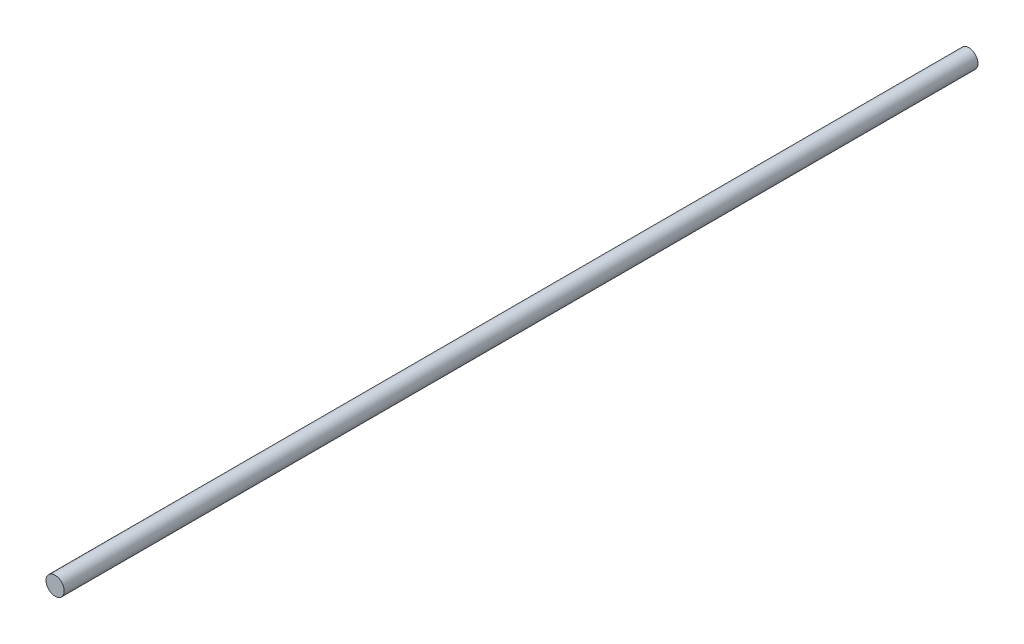
ISO-10303-21;
HEADER;
FILE_DESCRIPTION(('STEP AP214'),'2;1');
FILE_NAME('part.step','',(''),(''),'','','');
FILE_SCHEMA(('AUTOMOTIVE_DESIGN { 1 0 10303 214 1 1 1 1 }'));
ENDSEC;
DATA;
#1=APPLICATION_CONTEXT('core data for automotive mechanical design processes');
#2=APPLICATION_PROTOCOL_DEFINITION('international standard','automotive_design',2000,#1);
#3=PRODUCT_CONTEXT('',#1,'mechanical');
#4=PRODUCT('Part','Part','',(#3));
#5=PRODUCT_RELATED_PRODUCT_CATEGORY('part','',(#4));
#6=PRODUCT_DEFINITION_FORMATION('','',#4);
#7=PRODUCT_DEFINITION_CONTEXT('part definition',#1,'design');
#8=PRODUCT_DEFINITION('design','',#6,#7);
#9=PRODUCT_DEFINITION_SHAPE('','',#8);
#10=(LENGTH_UNIT() NAMED_UNIT(*) SI_UNIT(.MILLI.,.METRE.));
#11=(NAMED_UNIT(*) PLANE_ANGLE_UNIT() SI_UNIT($,.RADIAN.));
#12=(NAMED_UNIT(*) SI_UNIT($,.STERADIAN.) SOLID_ANGLE_UNIT());
#13=UNCERTAINTY_MEASURE_WITH_UNIT(LENGTH_MEASURE(1.E-05),#10,'distance_accuracy_value','');
#14=(GEOMETRIC_REPRESENTATION_CONTEXT(3) GLOBAL_UNCERTAINTY_ASSIGNED_CONTEXT((#13)) GLOBAL_UNIT_ASSIGNED_CONTEXT((#10,
#11,#12)) REPRESENTATION_CONTEXT('',''));
#15=CARTESIAN_POINT('',(0.,0.,0.));
#16=DIRECTION('',(0.,0.,1.));
#17=DIRECTION('',(1.,0.,0.));
#18=AXIS2_PLACEMENT_3D('',#15,#16,#17);
#19=CARTESIAN_POINT('',(0.,0.,150.));
#20=DIRECTION('',(0.,0.,-1.));
#21=DIRECTION('',(-1.,0.,0.));
#22=AXIS2_PLACEMENT_3D('',#19,#20,#21);
#23=CYLINDRICAL_SURFACE('',#22,1.5);
#24=CARTESIAN_POINT('',(0.,0.,150.));
#25=DIRECTION('',(0.,0.,1.));
#26=DIRECTION('',(1.,0.,0.));
#27=AXIS2_PLACEMENT_3D('',#24,#25,#26);
#28=CIRCLE('',#27,1.5);
#29=CARTESIAN_POINT('',(1.5,0.,150.));
#30=VERTEX_POINT('',#29);
#31=EDGE_CURVE('E10',#30,#30,#28,.T.);
#32=ORIENTED_EDGE('',*,*,#31,.F.);
#33=EDGE_LOOP('',(#32));
#34=FACE_BOUND('',#33,.T.);
#35=CARTESIAN_POINT('',(0.,0.,0.));
#36=DIRECTION('',(0.,0.,1.));
#37=DIRECTION('',(1.,0.,0.));
#38=AXIS2_PLACEMENT_3D('',#35,#36,#37);
#39=CIRCLE('',#38,1.5);
#40=CARTESIAN_POINT('',(1.5,0.,0.));
#41=VERTEX_POINT('',#40);
#42=EDGE_CURVE('E34',#41,#41,#39,.T.);
#43=ORIENTED_EDGE('',*,*,#42,.T.);
#44=EDGE_LOOP('',(#43));
#45=FACE_BOUND('',#44,.T.);
#46=ADVANCED_FACE('F31',(#34,#45),#23,.T.);
#47=CARTESIAN_POINT('',(0.,0.,150.));
#48=DIRECTION('',(0.,0.,1.));
#49=DIRECTION('',(1.,0.,0.));
#50=AXIS2_PLACEMENT_3D('',#47,#48,#49);
#51=PLANE('',#50);
#52=ORIENTED_EDGE('',*,*,#31,.T.);
#53=EDGE_LOOP('',(#52));
#54=FACE_BOUND('',#53,.T.);
#55=ADVANCED_FACE('F46',(#54),#51,.T.);
#56=CARTESIAN_POINT('',(0.,0.,0.));
#57=DIRECTION('',(0.,0.,1.));
#58=DIRECTION('',(1.,0.,0.));
#59=AXIS2_PLACEMENT_3D('',#56,#57,#58);
#60=PLANE('',#59);
#61=ORIENTED_EDGE('',*,*,#42,.F.);
#62=EDGE_LOOP('',(#61));
#63=FACE_BOUND('',#62,.T.);
#64=ADVANCED_FACE('F44',(#63),#60,.F.);
#65=CLOSED_SHELL('',(#46,#55,#64));
#66=MANIFOLD_SOLID_BREP('B2',#65);
#67=ADVANCED_BREP_SHAPE_REPRESENTATION('',(#18,#66),#14);
#68=SHAPE_DEFINITION_REPRESENTATION(#9,#67);
ENDSEC;
END-ISO-10303-21;
